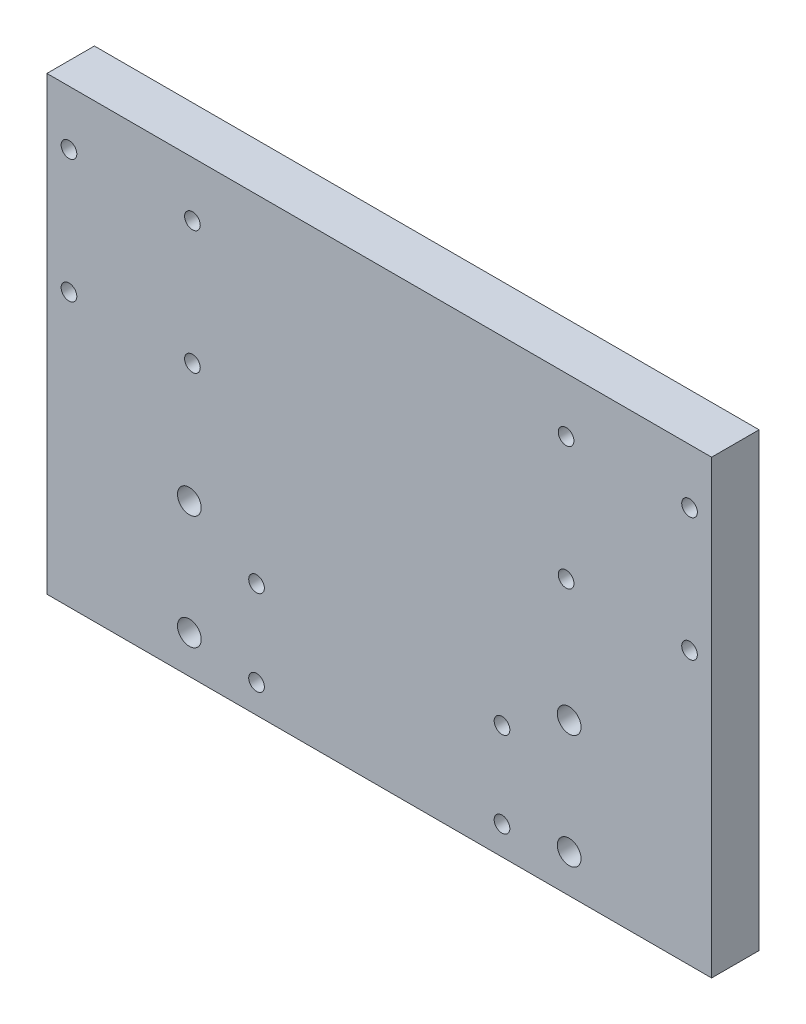
ISO-10303-21;
HEADER;
FILE_DESCRIPTION(('STEP AP214'),'2;1');
FILE_NAME('part.step','',(''),(''),'','','');
FILE_SCHEMA(('AUTOMOTIVE_DESIGN { 1 0 10303 214 1 1 1 1 }'));
ENDSEC;
DATA;
#1=APPLICATION_CONTEXT('core data for automotive mechanical design processes');
#2=APPLICATION_PROTOCOL_DEFINITION('international standard','automotive_design',2000,#1);
#3=PRODUCT_CONTEXT('',#1,'mechanical');
#4=PRODUCT('Part','Part','',(#3));
#5=PRODUCT_RELATED_PRODUCT_CATEGORY('part','',(#4));
#6=PRODUCT_DEFINITION_FORMATION('','',#4);
#7=PRODUCT_DEFINITION_CONTEXT('part definition',#1,'design');
#8=PRODUCT_DEFINITION('design','',#6,#7);
#9=PRODUCT_DEFINITION_SHAPE('','',#8);
#10=(LENGTH_UNIT() NAMED_UNIT(*) SI_UNIT(.MILLI.,.METRE.));
#11=(NAMED_UNIT(*) PLANE_ANGLE_UNIT() SI_UNIT($,.RADIAN.));
#12=(NAMED_UNIT(*) SI_UNIT($,.STERADIAN.) SOLID_ANGLE_UNIT());
#13=UNCERTAINTY_MEASURE_WITH_UNIT(LENGTH_MEASURE(1.E-05),#10,'distance_accuracy_value','');
#14=(GEOMETRIC_REPRESENTATION_CONTEXT(3) GLOBAL_UNCERTAINTY_ASSIGNED_CONTEXT((#13)) GLOBAL_UNIT_ASSIGNED_CONTEXT((#10,
#11,#12)) REPRESENTATION_CONTEXT('',''));
#15=CARTESIAN_POINT('',(0.,0.,0.));
#16=DIRECTION('',(0.,0.,1.));
#17=DIRECTION('',(1.,0.,0.));
#18=AXIS2_PLACEMENT_3D('',#15,#16,#17);
#19=CARTESIAN_POINT('',(0.,0.,10.));
#20=DIRECTION('',(1.,0.,0.));
#21=DIRECTION('',(0.,0.,-1.));
#22=AXIS2_PLACEMENT_3D('',#19,#20,#21);
#23=PLANE('',#22);
#24=DIRECTION('',(0.,-1.,0.));
#25=VECTOR('',#24,1.);
#26=CARTESIAN_POINT('',(0.,0.,0.));
#27=LINE('',#26,#25);
#28=CARTESIAN_POINT('',(0.,95.,0.));
#29=VERTEX_POINT('',#28);
#30=CARTESIAN_POINT('',(0.,0.,0.));
#31=VERTEX_POINT('',#30);
#32=EDGE_CURVE('E111',#29,#31,#27,.T.);
#33=ORIENTED_EDGE('',*,*,#32,.T.);
#34=DIRECTION('',(0.,0.,-1.));
#35=VECTOR('',#34,1.);
#36=CARTESIAN_POINT('',(0.,0.,10.));
#37=LINE('',#36,#35);
#38=CARTESIAN_POINT('',(0.,0.,10.));
#39=VERTEX_POINT('',#38);
#40=EDGE_CURVE('E11',#39,#31,#37,.T.);
#41=ORIENTED_EDGE('',*,*,#40,.F.);
#42=DIRECTION('',(0.,-1.,0.));
#43=VECTOR('',#42,1.);
#44=CARTESIAN_POINT('',(0.,0.,10.));
#45=LINE('',#44,#43);
#46=CARTESIAN_POINT('',(0.,95.,10.));
#47=VERTEX_POINT('',#46);
#48=EDGE_CURVE('E94',#47,#39,#45,.T.);
#49=ORIENTED_EDGE('',*,*,#48,.F.);
#50=DIRECTION('',(0.,0.,-1.));
#51=VECTOR('',#50,1.);
#52=CARTESIAN_POINT('',(0.,95.,10.));
#53=LINE('',#52,#51);
#54=EDGE_CURVE('E107',#47,#29,#53,.T.);
#55=ORIENTED_EDGE('',*,*,#54,.T.);
#56=EDGE_LOOP('',(#33,#41,#49,#55));
#57=FACE_BOUND('',#56,.T.);
#58=ADVANCED_FACE('F42',(#57),#23,.F.);
#59=CARTESIAN_POINT('',(0.,0.,10.));
#60=DIRECTION('',(0.,1.,0.));
#61=DIRECTION('',(0.,0.,1.));
#62=AXIS2_PLACEMENT_3D('',#59,#60,#61);
#63=PLANE('',#62);
#64=DIRECTION('',(1.,0.,0.));
#65=VECTOR('',#64,1.);
#66=CARTESIAN_POINT('',(0.,0.,0.));
#67=LINE('',#66,#65);
#68=CARTESIAN_POINT('',(140.,0.,0.));
#69=VERTEX_POINT('',#68);
#70=EDGE_CURVE('E99',#31,#69,#67,.T.);
#71=ORIENTED_EDGE('',*,*,#70,.T.);
#72=DIRECTION('',(0.,0.,-1.));
#73=VECTOR('',#72,1.);
#74=CARTESIAN_POINT('',(140.,0.,10.));
#75=LINE('',#74,#73);
#76=CARTESIAN_POINT('',(140.,0.,10.));
#77=VERTEX_POINT('',#76);
#78=EDGE_CURVE('E51',#77,#69,#75,.T.);
#79=ORIENTED_EDGE('',*,*,#78,.F.);
#80=DIRECTION('',(1.,0.,0.));
#81=VECTOR('',#80,1.);
#82=CARTESIAN_POINT('',(0.,0.,10.));
#83=LINE('',#82,#81);
#84=EDGE_CURVE('E89',#39,#77,#83,.T.);
#85=ORIENTED_EDGE('',*,*,#84,.F.);
#86=ORIENTED_EDGE('',*,*,#40,.T.);
#87=EDGE_LOOP('',(#71,#79,#85,#86));
#88=FACE_BOUND('',#87,.T.);
#89=ADVANCED_FACE('F98',(#88),#63,.F.);
#90=CARTESIAN_POINT('',(140.,0.,10.));
#91=DIRECTION('',(-1.,0.,0.));
#92=DIRECTION('',(0.,0.,1.));
#93=AXIS2_PLACEMENT_3D('',#90,#91,#92);
#94=PLANE('',#93);
#95=DIRECTION('',(0.,1.,0.));
#96=VECTOR('',#95,1.);
#97=CARTESIAN_POINT('',(140.,0.,0.));
#98=LINE('',#97,#96);
#99=CARTESIAN_POINT('',(140.,95.,0.));
#100=VERTEX_POINT('',#99);
#101=EDGE_CURVE('E76',#69,#100,#98,.T.);
#102=ORIENTED_EDGE('',*,*,#101,.T.);
#103=DIRECTION('',(0.,0.,-1.));
#104=VECTOR('',#103,1.);
#105=CARTESIAN_POINT('',(140.,95.,10.));
#106=LINE('',#105,#104);
#107=CARTESIAN_POINT('',(140.,95.,10.));
#108=VERTEX_POINT('',#107);
#109=EDGE_CURVE('E101',#108,#100,#106,.T.);
#110=ORIENTED_EDGE('',*,*,#109,.F.);
#111=DIRECTION('',(0.,1.,0.));
#112=VECTOR('',#111,1.);
#113=CARTESIAN_POINT('',(140.,0.,10.));
#114=LINE('',#113,#112);
#115=EDGE_CURVE('E92',#77,#108,#114,.T.);
#116=ORIENTED_EDGE('',*,*,#115,.F.);
#117=ORIENTED_EDGE('',*,*,#78,.T.);
#118=EDGE_LOOP('',(#102,#110,#116,#117));
#119=FACE_BOUND('',#118,.T.);
#120=ADVANCED_FACE('F102',(#119),#94,.F.);
#121=CARTESIAN_POINT('',(0.,95.,10.));
#122=DIRECTION('',(0.,-1.,0.));
#123=DIRECTION('',(0.,0.,-1.));
#124=AXIS2_PLACEMENT_3D('',#121,#122,#123);
#125=PLANE('',#124);
#126=DIRECTION('',(-1.,0.,0.));
#127=VECTOR('',#126,1.);
#128=CARTESIAN_POINT('',(0.,95.,0.));
#129=LINE('',#128,#127);
#130=EDGE_CURVE('E82',#100,#29,#129,.T.);
#131=ORIENTED_EDGE('',*,*,#130,.T.);
#132=ORIENTED_EDGE('',*,*,#54,.F.);
#133=DIRECTION('',(-1.,0.,0.));
#134=VECTOR('',#133,1.);
#135=CARTESIAN_POINT('',(0.,95.,10.));
#136=LINE('',#135,#134);
#137=EDGE_CURVE('E59',#108,#47,#136,.T.);
#138=ORIENTED_EDGE('',*,*,#137,.F.);
#139=ORIENTED_EDGE('',*,*,#109,.T.);
#140=EDGE_LOOP('',(#131,#132,#138,#139));
#141=FACE_BOUND('',#140,.T.);
#142=ADVANCED_FACE('F126',(#141),#125,.F.);
#143=CARTESIAN_POINT('',(0.,0.,10.));
#144=DIRECTION('',(0.,0.,-1.));
#145=DIRECTION('',(-1.,0.,0.));
#146=AXIS2_PLACEMENT_3D('',#143,#144,#145);
#147=PLANE('',#146);
#148=CARTESIAN_POINT('',(29.9999999999968,32.0000000000001,10.));
#149=DIRECTION('',(0.,0.,1.));
#150=DIRECTION('',(1.,0.,0.));
#151=AXIS2_PLACEMENT_3D('',#148,#149,#150);
#152=CIRCLE('',#151,2.5);
#153=CARTESIAN_POINT('',(32.4999999999968,32.0000000000001,10.));
#154=VERTEX_POINT('',#153);
#155=EDGE_CURVE('E257',#154,#154,#152,.T.);
#156=ORIENTED_EDGE('',*,*,#155,.F.);
#157=EDGE_LOOP('',(#156));
#158=FACE_BOUND('',#157,.T.);
#159=CARTESIAN_POINT('',(29.9999999999971,8.0000000000001,10.));
#160=DIRECTION('',(0.,0.,1.));
#161=DIRECTION('',(1.,0.,0.));
#162=AXIS2_PLACEMENT_3D('',#159,#160,#161);
#163=CIRCLE('',#162,2.5);
#164=CARTESIAN_POINT('',(32.4999999999971,8.0000000000001,10.));
#165=VERTEX_POINT('',#164);
#166=EDGE_CURVE('E249',#165,#165,#163,.T.);
#167=ORIENTED_EDGE('',*,*,#166,.F.);
#168=EDGE_LOOP('',(#167));
#169=FACE_BOUND('',#168,.T.);
#170=CARTESIAN_POINT('',(110.000000000003,32.0000000000001,10.));
#171=DIRECTION('',(0.,0.,1.));
#172=DIRECTION('',(1.,0.,0.));
#173=AXIS2_PLACEMENT_3D('',#170,#171,#172);
#174=CIRCLE('',#173,2.5);
#175=CARTESIAN_POINT('',(112.500000000003,32.0000000000001,10.));
#176=VERTEX_POINT('',#175);
#177=EDGE_CURVE('E241',#176,#176,#174,.T.);
#178=ORIENTED_EDGE('',*,*,#177,.F.);
#179=EDGE_LOOP('',(#178));
#180=FACE_BOUND('',#179,.T.);
#181=CARTESIAN_POINT('',(110.000000000003,8.00000000000012,10.));
#182=DIRECTION('',(0.,0.,1.));
#183=DIRECTION('',(1.,0.,0.));
#184=AXIS2_PLACEMENT_3D('',#181,#182,#183);
#185=CIRCLE('',#184,2.5);
#186=CARTESIAN_POINT('',(112.500000000003,8.00000000000012,10.));
#187=VERTEX_POINT('',#186);
#188=EDGE_CURVE('E233',#187,#187,#185,.T.);
#189=ORIENTED_EDGE('',*,*,#188,.F.);
#190=EDGE_LOOP('',(#189));
#191=FACE_BOUND('',#190,.T.);
#192=CARTESIAN_POINT('',(4.64999999999978,83.4500000000013,10.));
#193=DIRECTION('',(0.,0.,1.));
#194=DIRECTION('',(1.,0.,0.));
#195=AXIS2_PLACEMENT_3D('',#192,#193,#194);
#196=CIRCLE('',#195,1.64999999999999);
#197=CARTESIAN_POINT('',(6.29999999999976,83.4500000000013,10.));
#198=VERTEX_POINT('',#197);
#199=EDGE_CURVE('E225',#198,#198,#196,.T.);
#200=ORIENTED_EDGE('',*,*,#199,.F.);
#201=EDGE_LOOP('',(#200));
#202=FACE_BOUND('',#201,.T.);
#203=CARTESIAN_POINT('',(4.6499999999996,57.4500000000013,10.));
#204=DIRECTION('',(0.,0.,1.));
#205=DIRECTION('',(1.,0.,0.));
#206=AXIS2_PLACEMENT_3D('',#203,#204,#205);
#207=CIRCLE('',#206,1.64999999999999);
#208=CARTESIAN_POINT('',(6.29999999999959,57.4500000000013,10.));
#209=VERTEX_POINT('',#208);
#210=EDGE_CURVE('E217',#209,#209,#207,.T.);
#211=ORIENTED_EDGE('',*,*,#210,.F.);
#212=EDGE_LOOP('',(#211));
#213=FACE_BOUND('',#212,.T.);
#214=CARTESIAN_POINT('',(30.6499999999996,57.4500000000011,10.));
#215=DIRECTION('',(0.,0.,1.));
#216=DIRECTION('',(1.,0.,0.));
#217=AXIS2_PLACEMENT_3D('',#214,#215,#216);
#218=CIRCLE('',#217,1.64999999999999);
#219=CARTESIAN_POINT('',(32.2999999999996,57.4500000000011,10.));
#220=VERTEX_POINT('',#219);
#221=EDGE_CURVE('E209',#220,#220,#218,.T.);
#222=ORIENTED_EDGE('',*,*,#221,.F.);
#223=EDGE_LOOP('',(#222));
#224=FACE_BOUND('',#223,.T.);
#225=CARTESIAN_POINT('',(30.6499999999998,83.4500000000011,10.));
#226=DIRECTION('',(0.,0.,1.));
#227=DIRECTION('',(1.,0.,0.));
#228=AXIS2_PLACEMENT_3D('',#225,#226,#227);
#229=CIRCLE('',#228,1.64999999999998);
#230=CARTESIAN_POINT('',(32.2999999999998,83.4500000000011,10.));
#231=VERTEX_POINT('',#230);
#232=EDGE_CURVE('E201',#231,#231,#229,.T.);
#233=ORIENTED_EDGE('',*,*,#232,.F.);
#234=EDGE_LOOP('',(#233));
#235=FACE_BOUND('',#234,.T.);
#236=CARTESIAN_POINT('',(109.35,83.4500000000011,10.));
#237=DIRECTION('',(0.,0.,1.));
#238=DIRECTION('',(1.,0.,0.));
#239=AXIS2_PLACEMENT_3D('',#236,#237,#238);
#240=CIRCLE('',#239,1.64999999999998);
#241=CARTESIAN_POINT('',(111.,83.4500000000011,10.));
#242=VERTEX_POINT('',#241);
#243=EDGE_CURVE('E193',#242,#242,#240,.T.);
#244=ORIENTED_EDGE('',*,*,#243,.F.);
#245=EDGE_LOOP('',(#244));
#246=FACE_BOUND('',#245,.T.);
#247=CARTESIAN_POINT('',(135.35,83.4500000000013,10.));
#248=DIRECTION('',(0.,0.,1.));
#249=DIRECTION('',(1.,0.,0.));
#250=AXIS2_PLACEMENT_3D('',#247,#248,#249);
#251=CIRCLE('',#250,1.64999999999998);
#252=CARTESIAN_POINT('',(137.,83.4500000000013,10.));
#253=VERTEX_POINT('',#252);
#254=EDGE_CURVE('E185',#253,#253,#251,.T.);
#255=ORIENTED_EDGE('',*,*,#254,.F.);
#256=EDGE_LOOP('',(#255));
#257=FACE_BOUND('',#256,.T.);
#258=CARTESIAN_POINT('',(135.35,57.4500000000013,10.));
#259=DIRECTION('',(0.,0.,1.));
#260=DIRECTION('',(1.,0.,0.));
#261=AXIS2_PLACEMENT_3D('',#258,#259,#260);
#262=CIRCLE('',#261,1.64999999999998);
#263=CARTESIAN_POINT('',(137.,57.4500000000013,10.));
#264=VERTEX_POINT('',#263);
#265=EDGE_CURVE('E177',#264,#264,#262,.T.);
#266=ORIENTED_EDGE('',*,*,#265,.F.);
#267=EDGE_LOOP('',(#266));
#268=FACE_BOUND('',#267,.T.);
#269=CARTESIAN_POINT('',(109.35,57.4500000000011,10.));
#270=DIRECTION('',(0.,0.,1.));
#271=DIRECTION('',(1.,0.,0.));
#272=AXIS2_PLACEMENT_3D('',#269,#270,#271);
#273=CIRCLE('',#272,1.64999999999998);
#274=CARTESIAN_POINT('',(111.,57.4500000000011,10.));
#275=VERTEX_POINT('',#274);
#276=EDGE_CURVE('E169',#275,#275,#273,.T.);
#277=ORIENTED_EDGE('',*,*,#276,.F.);
#278=EDGE_LOOP('',(#277));
#279=FACE_BOUND('',#278,.T.);
#280=CARTESIAN_POINT('',(44.1499999999994,24.000000000001,10.));
#281=DIRECTION('',(0.,0.,1.));
#282=DIRECTION('',(1.,0.,0.));
#283=AXIS2_PLACEMENT_3D('',#280,#281,#282);
#284=CIRCLE('',#283,1.64999999999998);
#285=CARTESIAN_POINT('',(45.7999999999994,24.000000000001,10.));
#286=VERTEX_POINT('',#285);
#287=EDGE_CURVE('E161',#286,#286,#284,.T.);
#288=ORIENTED_EDGE('',*,*,#287,.F.);
#289=EDGE_LOOP('',(#288));
#290=FACE_BOUND('',#289,.T.);
#291=CARTESIAN_POINT('',(44.1499999999993,6.00000000000104,10.));
#292=DIRECTION('',(0.,0.,1.));
#293=DIRECTION('',(1.,0.,0.));
#294=AXIS2_PLACEMENT_3D('',#291,#292,#293);
#295=CIRCLE('',#294,1.64999999999998);
#296=CARTESIAN_POINT('',(45.7999999999993,6.00000000000104,10.));
#297=VERTEX_POINT('',#296);
#298=EDGE_CURVE('E153',#297,#297,#295,.T.);
#299=ORIENTED_EDGE('',*,*,#298,.F.);
#300=EDGE_LOOP('',(#299));
#301=FACE_BOUND('',#300,.T.);
#302=CARTESIAN_POINT('',(95.8500000000006,24.000000000001,10.));
#303=DIRECTION('',(0.,0.,1.));
#304=DIRECTION('',(1.,0.,0.));
#305=AXIS2_PLACEMENT_3D('',#302,#303,#304);
#306=CIRCLE('',#305,1.64999999999998);
#307=CARTESIAN_POINT('',(97.5000000000006,24.000000000001,10.));
#308=VERTEX_POINT('',#307);
#309=EDGE_CURVE('E145',#308,#308,#306,.T.);
#310=ORIENTED_EDGE('',*,*,#309,.F.);
#311=EDGE_LOOP('',(#310));
#312=FACE_BOUND('',#311,.T.);
#313=CARTESIAN_POINT('',(95.8500000000008,6.00000000000104,10.));
#314=DIRECTION('',(0.,0.,1.));
#315=DIRECTION('',(1.,0.,0.));
#316=AXIS2_PLACEMENT_3D('',#313,#314,#315);
#317=CIRCLE('',#316,1.64999999999998);
#318=CARTESIAN_POINT('',(97.5000000000008,6.00000000000104,10.));
#319=VERTEX_POINT('',#318);
#320=EDGE_CURVE('E137',#319,#319,#317,.T.);
#321=ORIENTED_EDGE('',*,*,#320,.F.);
#322=EDGE_LOOP('',(#321));
#323=FACE_BOUND('',#322,.T.);
#324=ORIENTED_EDGE('',*,*,#48,.T.);
#325=ORIENTED_EDGE('',*,*,#84,.T.);
#326=ORIENTED_EDGE('',*,*,#115,.T.);
#327=ORIENTED_EDGE('',*,*,#137,.T.);
#328=EDGE_LOOP('',(#324,#325,#326,#327));
#329=FACE_BOUND('',#328,.T.);
#330=ADVANCED_FACE('F90',(#158,#169,#180,#191,#202,#213,#224,#235,#246,#257,#268,#279,#290,#301,
#312,#323,#329),#147,.F.);
#331=CARTESIAN_POINT('',(0.,0.,0.));
#332=DIRECTION('',(0.,0.,-1.));
#333=DIRECTION('',(-1.,0.,0.));
#334=AXIS2_PLACEMENT_3D('',#331,#332,#333);
#335=PLANE('',#334);
#336=CARTESIAN_POINT('',(29.9999999999968,32.0000000000001,0.));
#337=DIRECTION('',(0.,0.,1.));
#338=DIRECTION('',(1.,0.,0.));
#339=AXIS2_PLACEMENT_3D('',#336,#337,#338);
#340=CIRCLE('',#339,2.5);
#341=CARTESIAN_POINT('',(32.4999999999968,32.0000000000001,0.));
#342=VERTEX_POINT('',#341);
#343=EDGE_CURVE('E253',#342,#342,#340,.T.);
#344=ORIENTED_EDGE('',*,*,#343,.T.);
#345=EDGE_LOOP('',(#344));
#346=FACE_BOUND('',#345,.T.);
#347=CARTESIAN_POINT('',(29.9999999999971,8.0000000000001,0.));
#348=DIRECTION('',(0.,0.,1.));
#349=DIRECTION('',(1.,0.,0.));
#350=AXIS2_PLACEMENT_3D('',#347,#348,#349);
#351=CIRCLE('',#350,2.5);
#352=CARTESIAN_POINT('',(32.4999999999971,8.0000000000001,0.));
#353=VERTEX_POINT('',#352);
#354=EDGE_CURVE('E245',#353,#353,#351,.T.);
#355=ORIENTED_EDGE('',*,*,#354,.T.);
#356=EDGE_LOOP('',(#355));
#357=FACE_BOUND('',#356,.T.);
#358=CARTESIAN_POINT('',(110.000000000003,32.0000000000001,0.));
#359=DIRECTION('',(0.,0.,1.));
#360=DIRECTION('',(1.,0.,0.));
#361=AXIS2_PLACEMENT_3D('',#358,#359,#360);
#362=CIRCLE('',#361,2.5);
#363=CARTESIAN_POINT('',(112.500000000003,32.0000000000001,0.));
#364=VERTEX_POINT('',#363);
#365=EDGE_CURVE('E237',#364,#364,#362,.T.);
#366=ORIENTED_EDGE('',*,*,#365,.T.);
#367=EDGE_LOOP('',(#366));
#368=FACE_BOUND('',#367,.T.);
#369=CARTESIAN_POINT('',(110.000000000003,8.00000000000012,0.));
#370=DIRECTION('',(0.,0.,1.));
#371=DIRECTION('',(1.,0.,0.));
#372=AXIS2_PLACEMENT_3D('',#369,#370,#371);
#373=CIRCLE('',#372,2.5);
#374=CARTESIAN_POINT('',(112.500000000003,8.00000000000012,0.));
#375=VERTEX_POINT('',#374);
#376=EDGE_CURVE('E229',#375,#375,#373,.T.);
#377=ORIENTED_EDGE('',*,*,#376,.T.);
#378=EDGE_LOOP('',(#377));
#379=FACE_BOUND('',#378,.T.);
#380=CARTESIAN_POINT('',(4.64999999999978,83.4500000000013,0.));
#381=DIRECTION('',(0.,0.,1.));
#382=DIRECTION('',(1.,0.,0.));
#383=AXIS2_PLACEMENT_3D('',#380,#381,#382);
#384=CIRCLE('',#383,1.65);
#385=CARTESIAN_POINT('',(6.29999999999977,83.4500000000013,0.));
#386=VERTEX_POINT('',#385);
#387=EDGE_CURVE('E221',#386,#386,#384,.T.);
#388=ORIENTED_EDGE('',*,*,#387,.T.);
#389=EDGE_LOOP('',(#388));
#390=FACE_BOUND('',#389,.T.);
#391=CARTESIAN_POINT('',(4.6499999999996,57.4500000000013,0.));
#392=DIRECTION('',(0.,0.,1.));
#393=DIRECTION('',(1.,0.,0.));
#394=AXIS2_PLACEMENT_3D('',#391,#392,#393);
#395=CIRCLE('',#394,1.65);
#396=CARTESIAN_POINT('',(6.2999999999996,57.4500000000013,0.));
#397=VERTEX_POINT('',#396);
#398=EDGE_CURVE('E213',#397,#397,#395,.T.);
#399=ORIENTED_EDGE('',*,*,#398,.T.);
#400=EDGE_LOOP('',(#399));
#401=FACE_BOUND('',#400,.T.);
#402=CARTESIAN_POINT('',(30.6499999999996,57.4500000000011,0.));
#403=DIRECTION('',(0.,0.,1.));
#404=DIRECTION('',(1.,0.,0.));
#405=AXIS2_PLACEMENT_3D('',#402,#403,#404);
#406=CIRCLE('',#405,1.65);
#407=CARTESIAN_POINT('',(32.2999999999996,57.4500000000011,0.));
#408=VERTEX_POINT('',#407);
#409=EDGE_CURVE('E205',#408,#408,#406,.T.);
#410=ORIENTED_EDGE('',*,*,#409,.T.);
#411=EDGE_LOOP('',(#410));
#412=FACE_BOUND('',#411,.T.);
#413=CARTESIAN_POINT('',(30.6499999999998,83.4500000000011,0.));
#414=DIRECTION('',(0.,0.,1.));
#415=DIRECTION('',(1.,0.,0.));
#416=AXIS2_PLACEMENT_3D('',#413,#414,#415);
#417=CIRCLE('',#416,1.65);
#418=CARTESIAN_POINT('',(32.2999999999998,83.4500000000011,0.));
#419=VERTEX_POINT('',#418);
#420=EDGE_CURVE('E197',#419,#419,#417,.T.);
#421=ORIENTED_EDGE('',*,*,#420,.T.);
#422=EDGE_LOOP('',(#421));
#423=FACE_BOUND('',#422,.T.);
#424=CARTESIAN_POINT('',(109.35,83.4500000000011,0.));
#425=DIRECTION('',(0.,0.,1.));
#426=DIRECTION('',(1.,0.,0.));
#427=AXIS2_PLACEMENT_3D('',#424,#425,#426);
#428=CIRCLE('',#427,1.65);
#429=CARTESIAN_POINT('',(111.,83.4500000000011,0.));
#430=VERTEX_POINT('',#429);
#431=EDGE_CURVE('E189',#430,#430,#428,.T.);
#432=ORIENTED_EDGE('',*,*,#431,.T.);
#433=EDGE_LOOP('',(#432));
#434=FACE_BOUND('',#433,.T.);
#435=CARTESIAN_POINT('',(135.35,83.4500000000013,0.));
#436=DIRECTION('',(0.,0.,1.));
#437=DIRECTION('',(1.,0.,0.));
#438=AXIS2_PLACEMENT_3D('',#435,#436,#437);
#439=CIRCLE('',#438,1.64999999999998);
#440=CARTESIAN_POINT('',(137.,83.4500000000013,0.));
#441=VERTEX_POINT('',#440);
#442=EDGE_CURVE('E181',#441,#441,#439,.T.);
#443=ORIENTED_EDGE('',*,*,#442,.T.);
#444=EDGE_LOOP('',(#443));
#445=FACE_BOUND('',#444,.T.);
#446=CARTESIAN_POINT('',(135.35,57.4500000000013,0.));
#447=DIRECTION('',(0.,0.,1.));
#448=DIRECTION('',(1.,0.,0.));
#449=AXIS2_PLACEMENT_3D('',#446,#447,#448);
#450=CIRCLE('',#449,1.64999999999998);
#451=CARTESIAN_POINT('',(137.,57.4500000000013,0.));
#452=VERTEX_POINT('',#451);
#453=EDGE_CURVE('E173',#452,#452,#450,.T.);
#454=ORIENTED_EDGE('',*,*,#453,.T.);
#455=EDGE_LOOP('',(#454));
#456=FACE_BOUND('',#455,.T.);
#457=CARTESIAN_POINT('',(109.35,57.4500000000011,0.));
#458=DIRECTION('',(0.,0.,1.));
#459=DIRECTION('',(1.,0.,0.));
#460=AXIS2_PLACEMENT_3D('',#457,#458,#459);
#461=CIRCLE('',#460,1.65);
#462=CARTESIAN_POINT('',(111.,57.4500000000011,0.));
#463=VERTEX_POINT('',#462);
#464=EDGE_CURVE('E165',#463,#463,#461,.T.);
#465=ORIENTED_EDGE('',*,*,#464,.T.);
#466=EDGE_LOOP('',(#465));
#467=FACE_BOUND('',#466,.T.);
#468=CARTESIAN_POINT('',(44.1499999999994,24.000000000001,0.));
#469=DIRECTION('',(0.,0.,1.));
#470=DIRECTION('',(1.,0.,0.));
#471=AXIS2_PLACEMENT_3D('',#468,#469,#470);
#472=CIRCLE('',#471,1.65);
#473=CARTESIAN_POINT('',(45.7999999999994,24.000000000001,0.));
#474=VERTEX_POINT('',#473);
#475=EDGE_CURVE('E157',#474,#474,#472,.T.);
#476=ORIENTED_EDGE('',*,*,#475,.T.);
#477=EDGE_LOOP('',(#476));
#478=FACE_BOUND('',#477,.T.);
#479=CARTESIAN_POINT('',(44.1499999999993,6.00000000000104,0.));
#480=DIRECTION('',(0.,0.,1.));
#481=DIRECTION('',(1.,0.,0.));
#482=AXIS2_PLACEMENT_3D('',#479,#480,#481);
#483=CIRCLE('',#482,1.65);
#484=CARTESIAN_POINT('',(45.7999999999993,6.00000000000104,0.));
#485=VERTEX_POINT('',#484);
#486=EDGE_CURVE('E149',#485,#485,#483,.T.);
#487=ORIENTED_EDGE('',*,*,#486,.T.);
#488=EDGE_LOOP('',(#487));
#489=FACE_BOUND('',#488,.T.);
#490=CARTESIAN_POINT('',(95.8500000000006,24.000000000001,0.));
#491=DIRECTION('',(0.,0.,1.));
#492=DIRECTION('',(1.,0.,0.));
#493=AXIS2_PLACEMENT_3D('',#490,#491,#492);
#494=CIRCLE('',#493,1.65);
#495=CARTESIAN_POINT('',(97.5000000000006,24.000000000001,0.));
#496=VERTEX_POINT('',#495);
#497=EDGE_CURVE('E141',#496,#496,#494,.T.);
#498=ORIENTED_EDGE('',*,*,#497,.T.);
#499=EDGE_LOOP('',(#498));
#500=FACE_BOUND('',#499,.T.);
#501=CARTESIAN_POINT('',(95.8500000000008,6.00000000000104,0.));
#502=DIRECTION('',(0.,0.,1.));
#503=DIRECTION('',(1.,0.,0.));
#504=AXIS2_PLACEMENT_3D('',#501,#502,#503);
#505=CIRCLE('',#504,1.65);
#506=CARTESIAN_POINT('',(97.5000000000008,6.00000000000104,0.));
#507=VERTEX_POINT('',#506);
#508=EDGE_CURVE('E115',#507,#507,#505,.T.);
#509=ORIENTED_EDGE('',*,*,#508,.T.);
#510=EDGE_LOOP('',(#509));
#511=FACE_BOUND('',#510,.T.);
#512=ORIENTED_EDGE('',*,*,#32,.F.);
#513=ORIENTED_EDGE('',*,*,#130,.F.);
#514=ORIENTED_EDGE('',*,*,#101,.F.);
#515=ORIENTED_EDGE('',*,*,#70,.F.);
#516=EDGE_LOOP('',(#512,#513,#514,#515));
#517=FACE_BOUND('',#516,.T.);
#518=ADVANCED_FACE('F129',(#346,#357,#368,#379,#390,#401,#412,#423,#434,#445,#456,#467,#478,
#489,#500,#511,#517),#335,.T.);
#519=CARTESIAN_POINT('',(95.8500000000008,6.00000000000104,10.));
#520=DIRECTION('',(0.,0.,1.));
#521=DIRECTION('',(1.,0.,0.));
#522=AXIS2_PLACEMENT_3D('',#519,#520,#521);
#523=CYLINDRICAL_SURFACE('',#522,1.64999999999999);
#524=ORIENTED_EDGE('',*,*,#508,.F.);
#525=EDGE_LOOP('',(#524));
#526=FACE_BOUND('',#525,.T.);
#527=ORIENTED_EDGE('',*,*,#320,.T.);
#528=EDGE_LOOP('',(#527));
#529=FACE_BOUND('',#528,.T.);
#530=ADVANCED_FACE('F298',(#526,#529),#523,.F.);
#531=CARTESIAN_POINT('',(95.8500000000006,24.000000000001,10.));
#532=DIRECTION('',(0.,0.,1.));
#533=DIRECTION('',(1.,0.,0.));
#534=AXIS2_PLACEMENT_3D('',#531,#532,#533);
#535=CYLINDRICAL_SURFACE('',#534,1.64999999999999);
#536=ORIENTED_EDGE('',*,*,#497,.F.);
#537=EDGE_LOOP('',(#536));
#538=FACE_BOUND('',#537,.T.);
#539=ORIENTED_EDGE('',*,*,#309,.T.);
#540=EDGE_LOOP('',(#539));
#541=FACE_BOUND('',#540,.T.);
#542=ADVANCED_FACE('F300',(#538,#541),#535,.F.);
#543=CARTESIAN_POINT('',(44.1499999999993,6.00000000000104,10.));
#544=DIRECTION('',(0.,0.,1.));
#545=DIRECTION('',(1.,0.,0.));
#546=AXIS2_PLACEMENT_3D('',#543,#544,#545);
#547=CYLINDRICAL_SURFACE('',#546,1.64999999999999);
#548=ORIENTED_EDGE('',*,*,#486,.F.);
#549=EDGE_LOOP('',(#548));
#550=FACE_BOUND('',#549,.T.);
#551=ORIENTED_EDGE('',*,*,#298,.T.);
#552=EDGE_LOOP('',(#551));
#553=FACE_BOUND('',#552,.T.);
#554=ADVANCED_FACE('F307',(#550,#553),#547,.F.);
#555=CARTESIAN_POINT('',(44.1499999999994,24.000000000001,10.));
#556=DIRECTION('',(0.,0.,1.));
#557=DIRECTION('',(1.,0.,0.));
#558=AXIS2_PLACEMENT_3D('',#555,#556,#557);
#559=CYLINDRICAL_SURFACE('',#558,1.64999999999999);
#560=ORIENTED_EDGE('',*,*,#475,.F.);
#561=EDGE_LOOP('',(#560));
#562=FACE_BOUND('',#561,.T.);
#563=ORIENTED_EDGE('',*,*,#287,.T.);
#564=EDGE_LOOP('',(#563));
#565=FACE_BOUND('',#564,.T.);
#566=ADVANCED_FACE('F406',(#562,#565),#559,.F.);
#567=CARTESIAN_POINT('',(109.35,57.4500000000011,10.));
#568=DIRECTION('',(0.,0.,1.));
#569=DIRECTION('',(1.,0.,0.));
#570=AXIS2_PLACEMENT_3D('',#567,#568,#569);
#571=CYLINDRICAL_SURFACE('',#570,1.64999999999999);
#572=ORIENTED_EDGE('',*,*,#464,.F.);
#573=EDGE_LOOP('',(#572));
#574=FACE_BOUND('',#573,.T.);
#575=ORIENTED_EDGE('',*,*,#276,.T.);
#576=EDGE_LOOP('',(#575));
#577=FACE_BOUND('',#576,.T.);
#578=ADVANCED_FACE('F416',(#574,#577),#571,.F.);
#579=CARTESIAN_POINT('',(135.35,57.4500000000013,10.));
#580=DIRECTION('',(0.,0.,1.));
#581=DIRECTION('',(1.,0.,0.));
#582=AXIS2_PLACEMENT_3D('',#579,#580,#581);
#583=CYLINDRICAL_SURFACE('',#582,1.64999999999998);
#584=ORIENTED_EDGE('',*,*,#453,.F.);
#585=EDGE_LOOP('',(#584));
#586=FACE_BOUND('',#585,.T.);
#587=ORIENTED_EDGE('',*,*,#265,.T.);
#588=EDGE_LOOP('',(#587));
#589=FACE_BOUND('',#588,.T.);
#590=ADVANCED_FACE('F426',(#586,#589),#583,.F.);
#591=CARTESIAN_POINT('',(135.35,83.4500000000013,10.));
#592=DIRECTION('',(0.,0.,1.));
#593=DIRECTION('',(1.,0.,0.));
#594=AXIS2_PLACEMENT_3D('',#591,#592,#593);
#595=CYLINDRICAL_SURFACE('',#594,1.64999999999998);
#596=ORIENTED_EDGE('',*,*,#442,.F.);
#597=EDGE_LOOP('',(#596));
#598=FACE_BOUND('',#597,.T.);
#599=ORIENTED_EDGE('',*,*,#254,.T.);
#600=EDGE_LOOP('',(#599));
#601=FACE_BOUND('',#600,.T.);
#602=ADVANCED_FACE('F436',(#598,#601),#595,.F.);
#603=CARTESIAN_POINT('',(109.35,83.4500000000011,10.));
#604=DIRECTION('',(0.,0.,1.));
#605=DIRECTION('',(1.,0.,0.));
#606=AXIS2_PLACEMENT_3D('',#603,#604,#605);
#607=CYLINDRICAL_SURFACE('',#606,1.64999999999999);
#608=ORIENTED_EDGE('',*,*,#431,.F.);
#609=EDGE_LOOP('',(#608));
#610=FACE_BOUND('',#609,.T.);
#611=ORIENTED_EDGE('',*,*,#243,.T.);
#612=EDGE_LOOP('',(#611));
#613=FACE_BOUND('',#612,.T.);
#614=ADVANCED_FACE('F446',(#610,#613),#607,.F.);
#615=CARTESIAN_POINT('',(30.6499999999998,83.4500000000011,10.));
#616=DIRECTION('',(0.,0.,1.));
#617=DIRECTION('',(1.,0.,0.));
#618=AXIS2_PLACEMENT_3D('',#615,#616,#617);
#619=CYLINDRICAL_SURFACE('',#618,1.64999999999999);
#620=ORIENTED_EDGE('',*,*,#420,.F.);
#621=EDGE_LOOP('',(#620));
#622=FACE_BOUND('',#621,.T.);
#623=ORIENTED_EDGE('',*,*,#232,.T.);
#624=EDGE_LOOP('',(#623));
#625=FACE_BOUND('',#624,.T.);
#626=ADVANCED_FACE('F456',(#622,#625),#619,.F.);
#627=CARTESIAN_POINT('',(30.6499999999996,57.4500000000011,10.));
#628=DIRECTION('',(0.,0.,1.));
#629=DIRECTION('',(1.,0.,0.));
#630=AXIS2_PLACEMENT_3D('',#627,#628,#629);
#631=CYLINDRICAL_SURFACE('',#630,1.65);
#632=ORIENTED_EDGE('',*,*,#409,.F.);
#633=EDGE_LOOP('',(#632));
#634=FACE_BOUND('',#633,.T.);
#635=ORIENTED_EDGE('',*,*,#221,.T.);
#636=EDGE_LOOP('',(#635));
#637=FACE_BOUND('',#636,.T.);
#638=ADVANCED_FACE('F466',(#634,#637),#631,.F.);
#639=CARTESIAN_POINT('',(4.6499999999996,57.4500000000013,10.));
#640=DIRECTION('',(0.,0.,1.));
#641=DIRECTION('',(1.,0.,0.));
#642=AXIS2_PLACEMENT_3D('',#639,#640,#641);
#643=CYLINDRICAL_SURFACE('',#642,1.64999999999999);
#644=ORIENTED_EDGE('',*,*,#398,.F.);
#645=EDGE_LOOP('',(#644));
#646=FACE_BOUND('',#645,.T.);
#647=ORIENTED_EDGE('',*,*,#210,.T.);
#648=EDGE_LOOP('',(#647));
#649=FACE_BOUND('',#648,.T.);
#650=ADVANCED_FACE('F476',(#646,#649),#643,.F.);
#651=CARTESIAN_POINT('',(4.64999999999978,83.4500000000013,10.));
#652=DIRECTION('',(0.,0.,1.));
#653=DIRECTION('',(1.,0.,0.));
#654=AXIS2_PLACEMENT_3D('',#651,#652,#653);
#655=CYLINDRICAL_SURFACE('',#654,1.64999999999999);
#656=ORIENTED_EDGE('',*,*,#387,.F.);
#657=EDGE_LOOP('',(#656));
#658=FACE_BOUND('',#657,.T.);
#659=ORIENTED_EDGE('',*,*,#199,.T.);
#660=EDGE_LOOP('',(#659));
#661=FACE_BOUND('',#660,.T.);
#662=ADVANCED_FACE('F351',(#658,#661),#655,.F.);
#663=CARTESIAN_POINT('',(110.000000000003,8.00000000000012,10.));
#664=DIRECTION('',(0.,0.,1.));
#665=DIRECTION('',(1.,0.,0.));
#666=AXIS2_PLACEMENT_3D('',#663,#664,#665);
#667=CYLINDRICAL_SURFACE('',#666,2.5);
#668=ORIENTED_EDGE('',*,*,#376,.F.);
#669=EDGE_LOOP('',(#668));
#670=FACE_BOUND('',#669,.T.);
#671=ORIENTED_EDGE('',*,*,#188,.T.);
#672=EDGE_LOOP('',(#671));
#673=FACE_BOUND('',#672,.T.);
#674=ADVANCED_FACE('F344',(#670,#673),#667,.F.);
#675=CARTESIAN_POINT('',(110.000000000003,32.0000000000001,10.));
#676=DIRECTION('',(0.,0.,1.));
#677=DIRECTION('',(1.,0.,0.));
#678=AXIS2_PLACEMENT_3D('',#675,#676,#677);
#679=CYLINDRICAL_SURFACE('',#678,2.5);
#680=ORIENTED_EDGE('',*,*,#365,.F.);
#681=EDGE_LOOP('',(#680));
#682=FACE_BOUND('',#681,.T.);
#683=ORIENTED_EDGE('',*,*,#177,.T.);
#684=EDGE_LOOP('',(#683));
#685=FACE_BOUND('',#684,.T.);
#686=ADVANCED_FACE('F350',(#682,#685),#679,.F.);
#687=CARTESIAN_POINT('',(29.9999999999971,8.0000000000001,10.));
#688=DIRECTION('',(0.,0.,1.));
#689=DIRECTION('',(1.,0.,0.));
#690=AXIS2_PLACEMENT_3D('',#687,#688,#689);
#691=CYLINDRICAL_SURFACE('',#690,2.5);
#692=ORIENTED_EDGE('',*,*,#354,.F.);
#693=EDGE_LOOP('',(#692));
#694=FACE_BOUND('',#693,.T.);
#695=ORIENTED_EDGE('',*,*,#166,.T.);
#696=EDGE_LOOP('',(#695));
#697=FACE_BOUND('',#696,.T.);
#698=ADVANCED_FACE('F364',(#694,#697),#691,.F.);
#699=CARTESIAN_POINT('',(29.9999999999968,32.0000000000001,10.));
#700=DIRECTION('',(0.,0.,1.));
#701=DIRECTION('',(1.,0.,0.));
#702=AXIS2_PLACEMENT_3D('',#699,#700,#701);
#703=CYLINDRICAL_SURFACE('',#702,2.5);
#704=ORIENTED_EDGE('',*,*,#343,.F.);
#705=EDGE_LOOP('',(#704));
#706=FACE_BOUND('',#705,.T.);
#707=ORIENTED_EDGE('',*,*,#155,.T.);
#708=EDGE_LOOP('',(#707));
#709=FACE_BOUND('',#708,.T.);
#710=ADVANCED_FACE('F263',(#706,#709),#703,.F.);
#711=CLOSED_SHELL('',(#58,#89,#120,#142,#330,#518,#530,#542,#554,#566,#578,#590,#602,#614,#626,
#638,#650,#662,#674,#686,#698,#710));
#712=MANIFOLD_SOLID_BREP('B2',#711);
#713=ADVANCED_BREP_SHAPE_REPRESENTATION('',(#18,#712),#14);
#714=SHAPE_DEFINITION_REPRESENTATION(#9,#713);
ENDSEC;
END-ISO-10303-21;
